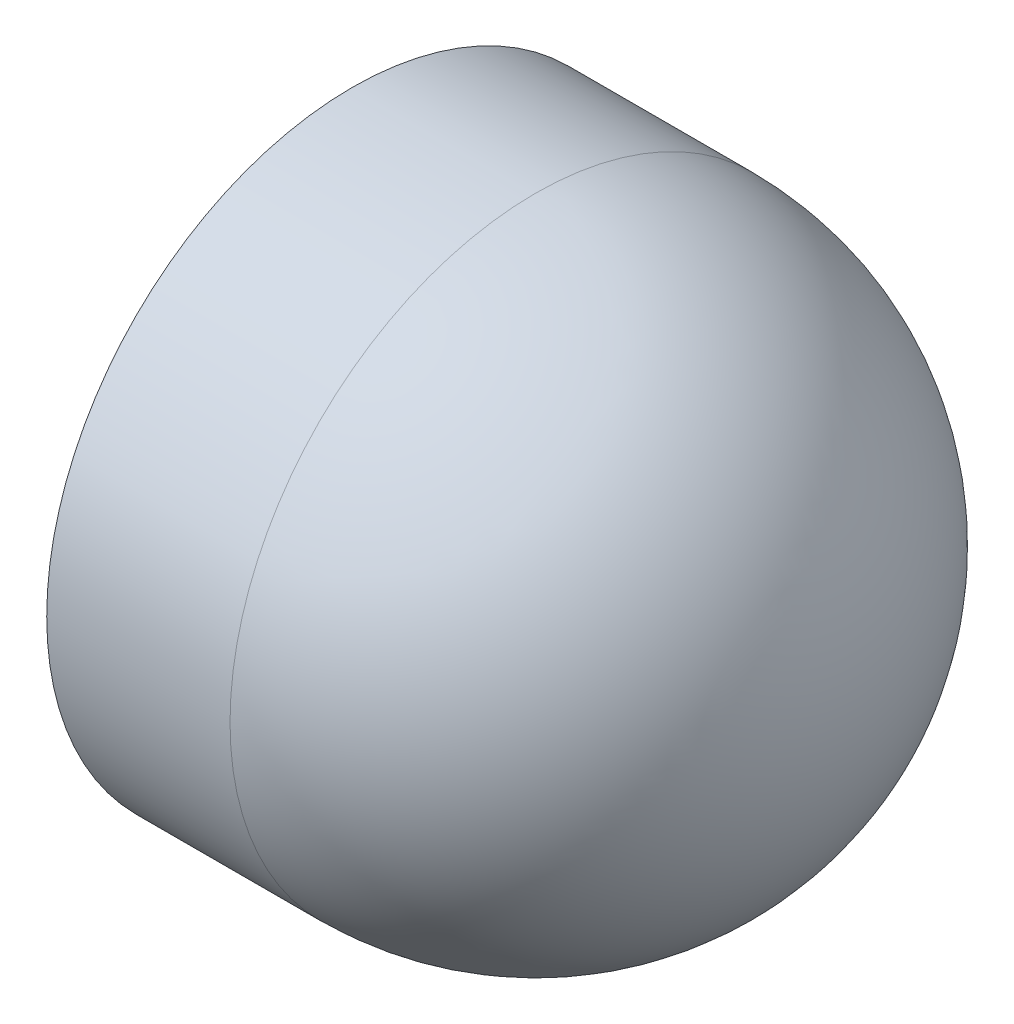
ISO-10303-21;
HEADER;
FILE_DESCRIPTION(('STEP AP214'),'2;1');
FILE_NAME('part.step','',(''),(''),'','','');
FILE_SCHEMA(('AUTOMOTIVE_DESIGN { 1 0 10303 214 1 1 1 1 }'));
ENDSEC;
DATA;
#1=APPLICATION_CONTEXT('core data for automotive mechanical design processes');
#2=APPLICATION_PROTOCOL_DEFINITION('international standard','automotive_design',2000,#1);
#3=PRODUCT_CONTEXT('',#1,'mechanical');
#4=PRODUCT('Part','Part','',(#3));
#5=PRODUCT_RELATED_PRODUCT_CATEGORY('part','',(#4));
#6=PRODUCT_DEFINITION_FORMATION('','',#4);
#7=PRODUCT_DEFINITION_CONTEXT('part definition',#1,'design');
#8=PRODUCT_DEFINITION('design','',#6,#7);
#9=PRODUCT_DEFINITION_SHAPE('','',#8);
#10=(LENGTH_UNIT() NAMED_UNIT(*) SI_UNIT(.MILLI.,.METRE.));
#11=(NAMED_UNIT(*) PLANE_ANGLE_UNIT() SI_UNIT($,.RADIAN.));
#12=(NAMED_UNIT(*) SI_UNIT($,.STERADIAN.) SOLID_ANGLE_UNIT());
#13=UNCERTAINTY_MEASURE_WITH_UNIT(LENGTH_MEASURE(1.E-05),#10,'distance_accuracy_value','');
#14=(GEOMETRIC_REPRESENTATION_CONTEXT(3) GLOBAL_UNCERTAINTY_ASSIGNED_CONTEXT((#13)) GLOBAL_UNIT_ASSIGNED_CONTEXT((#10,
#11,#12)) REPRESENTATION_CONTEXT('',''));
#15=CARTESIAN_POINT('',(0.,0.,0.));
#16=DIRECTION('',(0.,0.,1.));
#17=DIRECTION('',(1.,0.,0.));
#18=AXIS2_PLACEMENT_3D('',#15,#16,#17);
#19=CARTESIAN_POINT('',(0.,0.,0.));
#20=DIRECTION('',(-1.,0.,0.));
#21=DIRECTION('',(0.,0.,1.));
#22=AXIS2_PLACEMENT_3D('',#19,#20,#21);
#23=PLANE('',#22);
#24=CARTESIAN_POINT('',(0.,-2.74999999999999,-4.76313972081442));
#25=DIRECTION('',(-1.,0.,0.));
#26=DIRECTION('',(0.,0.,1.));
#27=AXIS2_PLACEMENT_3D('',#24,#25,#26);
#28=CIRCLE('',#27,1.127);
#29=CARTESIAN_POINT('',(0.,-2.74999999999999,-3.63613972081442));
#30=VERTEX_POINT('',#29);
#31=EDGE_CURVE('E175',#30,#30,#28,.T.);
#32=ORIENTED_EDGE('',*,*,#31,.F.);
#33=EDGE_LOOP('',(#32));
#34=FACE_BOUND('',#33,.T.);
#35=CARTESIAN_POINT('',(0.,5.5,0.));
#36=DIRECTION('',(-1.,0.,0.));
#37=DIRECTION('',(0.,0.,1.));
#38=AXIS2_PLACEMENT_3D('',#35,#36,#37);
#39=CIRCLE('',#38,1.127);
#40=CARTESIAN_POINT('',(0.,5.5,1.127));
#41=VERTEX_POINT('',#40);
#42=EDGE_CURVE('E179',#41,#41,#39,.T.);
#43=ORIENTED_EDGE('',*,*,#42,.F.);
#44=EDGE_LOOP('',(#43));
#45=FACE_BOUND('',#44,.T.);
#46=CARTESIAN_POINT('',(0.,-2.74999999999999,4.76313972081442));
#47=DIRECTION('',(-1.,0.,0.));
#48=DIRECTION('',(0.,0.,1.));
#49=AXIS2_PLACEMENT_3D('',#46,#47,#48);
#50=CIRCLE('',#49,1.127);
#51=CARTESIAN_POINT('',(0.,-2.74999999999999,5.89013972081442));
#52=VERTEX_POINT('',#51);
#53=EDGE_CURVE('E183',#52,#52,#50,.T.);
#54=ORIENTED_EDGE('',*,*,#53,.F.);
#55=EDGE_LOOP('',(#54));
#56=FACE_BOUND('',#55,.T.);
#57=DIRECTION('',(0.,0.866025403784438,-0.5));
#58=VECTOR('',#57,1.);
#59=CARTESIAN_POINT('',(0.,0.,4.1014963123231));
#60=LINE('',#59,#58);
#61=CARTESIAN_POINT('',(0.,0.,4.1014963123231));
#62=VERTEX_POINT('',#61);
#63=CARTESIAN_POINT('',(0.,3.552,2.05074815616155));
#64=VERTEX_POINT('',#63);
#65=EDGE_CURVE('E57',#62,#64,#60,.T.);
#66=ORIENTED_EDGE('',*,*,#65,.F.);
#67=DIRECTION('',(0.,0.866025403784439,0.5));
#68=VECTOR('',#67,1.);
#69=CARTESIAN_POINT('',(0.,-3.552,2.05074815616155));
#70=LINE('',#69,#68);
#71=CARTESIAN_POINT('',(0.,-3.552,2.05074815616155));
#72=VERTEX_POINT('',#71);
#73=EDGE_CURVE('E141',#72,#62,#70,.T.);
#74=ORIENTED_EDGE('',*,*,#73,.F.);
#75=DIRECTION('',(0.,0.,1.));
#76=VECTOR('',#75,1.);
#77=CARTESIAN_POINT('',(0.,-3.552,-2.05074815616155));
#78=LINE('',#77,#76);
#79=CARTESIAN_POINT('',(0.,-3.552,-2.05074815616155));
#80=VERTEX_POINT('',#79);
#81=EDGE_CURVE('E139',#80,#72,#78,.T.);
#82=ORIENTED_EDGE('',*,*,#81,.F.);
#83=DIRECTION('',(0.,-0.866025403784439,0.5));
#84=VECTOR('',#83,1.);
#85=CARTESIAN_POINT('',(0.,0.,-4.1014963123231));
#86=LINE('',#85,#84);
#87=CARTESIAN_POINT('',(0.,0.,-4.1014963123231));
#88=VERTEX_POINT('',#87);
#89=EDGE_CURVE('E105',#88,#80,#86,.T.);
#90=ORIENTED_EDGE('',*,*,#89,.F.);
#91=DIRECTION('',(0.,-0.866025403784439,-0.5));
#92=VECTOR('',#91,1.);
#93=CARTESIAN_POINT('',(0.,3.552,-2.05074815616155));
#94=LINE('',#93,#92);
#95=CARTESIAN_POINT('',(0.,3.552,-2.05074815616155));
#96=VERTEX_POINT('',#95);
#97=EDGE_CURVE('E135',#96,#88,#94,.T.);
#98=ORIENTED_EDGE('',*,*,#97,.F.);
#99=DIRECTION('',(0.,0.,-1.));
#100=VECTOR('',#99,1.);
#101=CARTESIAN_POINT('',(0.,3.552,2.05074815616155));
#102=LINE('',#101,#100);
#103=EDGE_CURVE('E131',#64,#96,#102,.T.);
#104=ORIENTED_EDGE('',*,*,#103,.F.);
#105=EDGE_LOOP('',(#66,#74,#82,#90,#98,#104));
#106=FACE_BOUND('',#105,.T.);
#107=CARTESIAN_POINT('',(0.,0.,0.));
#108=DIRECTION('',(-1.,0.,0.));
#109=DIRECTION('',(0.,0.,1.));
#110=AXIS2_PLACEMENT_3D('',#107,#108,#109);
#111=CIRCLE('',#110,7.5);
#112=CARTESIAN_POINT('',(0.,0.,7.5));
#113=VERTEX_POINT('',#112);
#114=EDGE_CURVE('E11',#113,#113,#111,.T.);
#115=ORIENTED_EDGE('',*,*,#114,.T.);
#116=EDGE_LOOP('',(#115));
#117=FACE_BOUND('',#116,.T.);
#118=ADVANCED_FACE('F43',(#34,#45,#56,#106,#117),#23,.T.);
#119=CARTESIAN_POINT('',(0.,0.,0.));
#120=DIRECTION('',(-1.,0.,0.));
#121=DIRECTION('',(0.,0.,1.));
#122=AXIS2_PLACEMENT_3D('',#119,#120,#121);
#123=CYLINDRICAL_SURFACE('',#122,7.5);
#124=CARTESIAN_POINT('',(4.5,0.,0.));
#125=DIRECTION('',(-1.,0.,0.));
#126=DIRECTION('',(0.,0.,1.));
#127=AXIS2_PLACEMENT_3D('',#124,#125,#126);
#128=CIRCLE('',#127,7.5);
#129=CARTESIAN_POINT('',(4.5,0.,7.5));
#130=VERTEX_POINT('',#129);
#131=EDGE_CURVE('E50',#130,#130,#128,.T.);
#132=ORIENTED_EDGE('',*,*,#131,.T.);
#133=EDGE_LOOP('',(#132));
#134=FACE_BOUND('',#133,.T.);
#135=ORIENTED_EDGE('',*,*,#114,.F.);
#136=EDGE_LOOP('',(#135));
#137=FACE_BOUND('',#136,.T.);
#138=ADVANCED_FACE('F152',(#134,#137),#123,.T.);
#139=CARTESIAN_POINT('',(4.5,0.,0.));
#140=DIRECTION('',(-1.,0.,0.));
#141=DIRECTION('',(0.,-1.,0.));
#142=AXIS2_PLACEMENT_3D('',#139,#140,#141);
#143=SPHERICAL_SURFACE('',#142,7.5);
#144=ORIENTED_EDGE('',*,*,#131,.F.);
#145=EDGE_LOOP('',(#144));
#146=FACE_BOUND('',#145,.T.);
#147=ADVANCED_FACE('F155',(#146),#143,.T.);
#148=CARTESIAN_POINT('',(2.75,0.,4.1014963123231));
#149=DIRECTION('',(0.,0.5,0.866025403784438));
#150=DIRECTION('',(0.,-0.866025403784438,0.5));
#151=AXIS2_PLACEMENT_3D('',#148,#149,#150);
#152=PLANE('',#151);
#153=ORIENTED_EDGE('',*,*,#65,.T.);
#154=DIRECTION('',(-1.,0.,0.));
#155=VECTOR('',#154,1.);
#156=CARTESIAN_POINT('',(2.75,3.552,2.05074815616155));
#157=LINE('',#156,#155);
#158=CARTESIAN_POINT('',(2.75,3.552,2.05074815616155));
#159=VERTEX_POINT('',#158);
#160=EDGE_CURVE('E87',#159,#64,#157,.T.);
#161=ORIENTED_EDGE('',*,*,#160,.F.);
#162=DIRECTION('',(0.,0.866025403784438,-0.5));
#163=VECTOR('',#162,1.);
#164=CARTESIAN_POINT('',(2.75,0.,4.1014963123231));
#165=LINE('',#164,#163);
#166=CARTESIAN_POINT('',(2.75,0.,4.1014963123231));
#167=VERTEX_POINT('',#166);
#168=EDGE_CURVE('E143',#167,#159,#165,.T.);
#169=ORIENTED_EDGE('',*,*,#168,.F.);
#170=DIRECTION('',(-1.,0.,0.));
#171=VECTOR('',#170,1.);
#172=CARTESIAN_POINT('',(2.75,0.,4.1014963123231));
#173=LINE('',#172,#171);
#174=EDGE_CURVE('E65',#167,#62,#173,.T.);
#175=ORIENTED_EDGE('',*,*,#174,.T.);
#176=EDGE_LOOP('',(#153,#161,#169,#175));
#177=FACE_BOUND('',#176,.T.);
#178=ADVANCED_FACE('F157',(#177),#152,.F.);
#179=CARTESIAN_POINT('',(2.75,-3.552,2.05074815616155));
#180=DIRECTION('',(0.,-0.5,0.866025403784439));
#181=DIRECTION('',(0.,-0.866025403784439,-0.5));
#182=AXIS2_PLACEMENT_3D('',#179,#180,#181);
#183=PLANE('',#182);
#184=ORIENTED_EDGE('',*,*,#73,.T.);
#185=ORIENTED_EDGE('',*,*,#174,.F.);
#186=DIRECTION('',(0.,0.866025403784439,0.5));
#187=VECTOR('',#186,1.);
#188=CARTESIAN_POINT('',(2.75,-3.552,2.05074815616155));
#189=LINE('',#188,#187);
#190=CARTESIAN_POINT('',(2.75,-3.552,2.05074815616155));
#191=VERTEX_POINT('',#190);
#192=EDGE_CURVE('E117',#191,#167,#189,.T.);
#193=ORIENTED_EDGE('',*,*,#192,.F.);
#194=DIRECTION('',(-1.,0.,0.));
#195=VECTOR('',#194,1.);
#196=CARTESIAN_POINT('',(2.75,-3.552,2.05074815616155));
#197=LINE('',#196,#195);
#198=EDGE_CURVE('E109',#191,#72,#197,.T.);
#199=ORIENTED_EDGE('',*,*,#198,.T.);
#200=EDGE_LOOP('',(#184,#185,#193,#199));
#201=FACE_BOUND('',#200,.T.);
#202=ADVANCED_FACE('F163',(#201),#183,.F.);
#203=CARTESIAN_POINT('',(2.75,-3.552,-2.05074815616155));
#204=DIRECTION('',(0.,-1.,0.));
#205=DIRECTION('',(0.,0.,-1.));
#206=AXIS2_PLACEMENT_3D('',#203,#204,#205);
#207=PLANE('',#206);
#208=ORIENTED_EDGE('',*,*,#81,.T.);
#209=ORIENTED_EDGE('',*,*,#198,.F.);
#210=DIRECTION('',(0.,0.,1.));
#211=VECTOR('',#210,1.);
#212=CARTESIAN_POINT('',(2.75,-3.552,-2.05074815616155));
#213=LINE('',#212,#211);
#214=CARTESIAN_POINT('',(2.75,-3.552,-2.05074815616155));
#215=VERTEX_POINT('',#214);
#216=EDGE_CURVE('E113',#215,#191,#213,.T.);
#217=ORIENTED_EDGE('',*,*,#216,.F.);
#218=DIRECTION('',(-1.,0.,0.));
#219=VECTOR('',#218,1.);
#220=CARTESIAN_POINT('',(2.75,-3.552,-2.05074815616155));
#221=LINE('',#220,#219);
#222=EDGE_CURVE('E98',#215,#80,#221,.T.);
#223=ORIENTED_EDGE('',*,*,#222,.T.);
#224=EDGE_LOOP('',(#208,#209,#217,#223));
#225=FACE_BOUND('',#224,.T.);
#226=ADVANCED_FACE('F114',(#225),#207,.F.);
#227=CARTESIAN_POINT('',(2.75,0.,-4.1014963123231));
#228=DIRECTION('',(0.,-0.5,-0.866025403784438));
#229=DIRECTION('',(0.,0.866025403784439,-0.5));
#230=AXIS2_PLACEMENT_3D('',#227,#228,#229);
#231=PLANE('',#230);
#232=ORIENTED_EDGE('',*,*,#89,.T.);
#233=ORIENTED_EDGE('',*,*,#222,.F.);
#234=DIRECTION('',(0.,-0.866025403784439,0.5));
#235=VECTOR('',#234,1.);
#236=CARTESIAN_POINT('',(2.75,0.,-4.1014963123231));
#237=LINE('',#236,#235);
#238=CARTESIAN_POINT('',(2.75,0.,-4.1014963123231));
#239=VERTEX_POINT('',#238);
#240=EDGE_CURVE('E102',#239,#215,#237,.T.);
#241=ORIENTED_EDGE('',*,*,#240,.F.);
#242=DIRECTION('',(-1.,0.,0.));
#243=VECTOR('',#242,1.);
#244=CARTESIAN_POINT('',(2.75,0.,-4.1014963123231));
#245=LINE('',#244,#243);
#246=EDGE_CURVE('E110',#239,#88,#245,.T.);
#247=ORIENTED_EDGE('',*,*,#246,.T.);
#248=EDGE_LOOP('',(#232,#233,#241,#247));
#249=FACE_BOUND('',#248,.T.);
#250=ADVANCED_FACE('F100',(#249),#231,.F.);
#251=CARTESIAN_POINT('',(2.75,3.552,-2.05074815616155));
#252=DIRECTION('',(0.,0.5,-0.866025403784439));
#253=DIRECTION('',(0.,0.866025403784439,0.5));
#254=AXIS2_PLACEMENT_3D('',#251,#252,#253);
#255=PLANE('',#254);
#256=ORIENTED_EDGE('',*,*,#97,.T.);
#257=ORIENTED_EDGE('',*,*,#246,.F.);
#258=DIRECTION('',(0.,-0.866025403784439,-0.5));
#259=VECTOR('',#258,1.);
#260=CARTESIAN_POINT('',(2.75,3.552,-2.05074815616155));
#261=LINE('',#260,#259);
#262=CARTESIAN_POINT('',(2.75,3.552,-2.05074815616155));
#263=VERTEX_POINT('',#262);
#264=EDGE_CURVE('E123',#263,#239,#261,.T.);
#265=ORIENTED_EDGE('',*,*,#264,.F.);
#266=DIRECTION('',(-1.,0.,0.));
#267=VECTOR('',#266,1.);
#268=CARTESIAN_POINT('',(2.75,3.552,-2.05074815616155));
#269=LINE('',#268,#267);
#270=EDGE_CURVE('E147',#263,#96,#269,.T.);
#271=ORIENTED_EDGE('',*,*,#270,.T.);
#272=EDGE_LOOP('',(#256,#257,#265,#271));
#273=FACE_BOUND('',#272,.T.);
#274=ADVANCED_FACE('F238',(#273),#255,.F.);
#275=CARTESIAN_POINT('',(2.75,3.552,2.05074815616155));
#276=DIRECTION('',(0.,1.,0.));
#277=DIRECTION('',(0.,0.,1.));
#278=AXIS2_PLACEMENT_3D('',#275,#276,#277);
#279=PLANE('',#278);
#280=ORIENTED_EDGE('',*,*,#103,.T.);
#281=ORIENTED_EDGE('',*,*,#270,.F.);
#282=DIRECTION('',(0.,0.,-1.));
#283=VECTOR('',#282,1.);
#284=CARTESIAN_POINT('',(2.75,3.552,2.05074815616155));
#285=LINE('',#284,#283);
#286=EDGE_CURVE('E125',#159,#263,#285,.T.);
#287=ORIENTED_EDGE('',*,*,#286,.F.);
#288=ORIENTED_EDGE('',*,*,#160,.T.);
#289=EDGE_LOOP('',(#280,#281,#287,#288));
#290=FACE_BOUND('',#289,.T.);
#291=ADVANCED_FACE('F190',(#290),#279,.F.);
#292=CARTESIAN_POINT('',(2.75,0.,0.));
#293=DIRECTION('',(-1.,0.,0.));
#294=DIRECTION('',(0.,0.,1.));
#295=AXIS2_PLACEMENT_3D('',#292,#293,#294);
#296=PLANE('',#295);
#297=ORIENTED_EDGE('',*,*,#168,.T.);
#298=ORIENTED_EDGE('',*,*,#286,.T.);
#299=ORIENTED_EDGE('',*,*,#264,.T.);
#300=ORIENTED_EDGE('',*,*,#240,.T.);
#301=ORIENTED_EDGE('',*,*,#216,.T.);
#302=ORIENTED_EDGE('',*,*,#192,.T.);
#303=EDGE_LOOP('',(#297,#298,#299,#300,#301,#302));
#304=FACE_BOUND('',#303,.T.);
#305=ADVANCED_FACE('F120',(#304),#296,.T.);
#306=CARTESIAN_POINT('',(2.1,-2.74999999999999,4.76313972081442));
#307=DIRECTION('',(-1.,0.,0.));
#308=DIRECTION('',(0.,0.,1.));
#309=AXIS2_PLACEMENT_3D('',#306,#307,#308);
#310=CYLINDRICAL_SURFACE('',#309,1.127);
#311=CARTESIAN_POINT('',(2.1,-2.74999999999999,4.76313972081442));
#312=DIRECTION('',(-1.,0.,0.));
#313=DIRECTION('',(0.,0.,1.));
#314=AXIS2_PLACEMENT_3D('',#311,#312,#313);
#315=CIRCLE('',#314,1.127);
#316=CARTESIAN_POINT('',(2.1,-2.74999999999999,5.89013972081442));
#317=VERTEX_POINT('',#316);
#318=EDGE_CURVE('E193',#317,#317,#315,.T.);
#319=ORIENTED_EDGE('',*,*,#318,.F.);
#320=EDGE_LOOP('',(#319));
#321=FACE_BOUND('',#320,.T.);
#322=ORIENTED_EDGE('',*,*,#53,.T.);
#323=EDGE_LOOP('',(#322));
#324=FACE_BOUND('',#323,.T.);
#325=ADVANCED_FACE('F225',(#321,#324),#310,.F.);
#326=CARTESIAN_POINT('',(2.1,-2.74999999999999,4.76313972081442));
#327=DIRECTION('',(-1.,0.,0.));
#328=DIRECTION('',(0.,0.,1.));
#329=AXIS2_PLACEMENT_3D('',#326,#327,#328);
#330=PLANE('',#329);
#331=ORIENTED_EDGE('',*,*,#318,.T.);
#332=EDGE_LOOP('',(#331));
#333=FACE_BOUND('',#332,.T.);
#334=ADVANCED_FACE('F222',(#333),#330,.T.);
#335=CARTESIAN_POINT('',(2.1,5.5,0.));
#336=DIRECTION('',(-1.,0.,0.));
#337=DIRECTION('',(0.,0.,1.));
#338=AXIS2_PLACEMENT_3D('',#335,#336,#337);
#339=CYLINDRICAL_SURFACE('',#338,1.127);
#340=CARTESIAN_POINT('',(2.1,5.5,0.));
#341=DIRECTION('',(-1.,0.,0.));
#342=DIRECTION('',(0.,0.,1.));
#343=AXIS2_PLACEMENT_3D('',#340,#341,#342);
#344=CIRCLE('',#343,1.127);
#345=CARTESIAN_POINT('',(2.1,5.5,1.127));
#346=VERTEX_POINT('',#345);
#347=EDGE_CURVE('E197',#346,#346,#344,.T.);
#348=ORIENTED_EDGE('',*,*,#347,.F.);
#349=EDGE_LOOP('',(#348));
#350=FACE_BOUND('',#349,.T.);
#351=ORIENTED_EDGE('',*,*,#42,.T.);
#352=EDGE_LOOP('',(#351));
#353=FACE_BOUND('',#352,.T.);
#354=ADVANCED_FACE('F217',(#350,#353),#339,.F.);
#355=CARTESIAN_POINT('',(2.1,5.5,0.));
#356=DIRECTION('',(-1.,0.,0.));
#357=DIRECTION('',(0.,0.,1.));
#358=AXIS2_PLACEMENT_3D('',#355,#356,#357);
#359=PLANE('',#358);
#360=ORIENTED_EDGE('',*,*,#347,.T.);
#361=EDGE_LOOP('',(#360));
#362=FACE_BOUND('',#361,.T.);
#363=ADVANCED_FACE('F210',(#362),#359,.T.);
#364=CARTESIAN_POINT('',(2.1,-2.74999999999999,-4.76313972081442));
#365=DIRECTION('',(-1.,0.,0.));
#366=DIRECTION('',(0.,0.,1.));
#367=AXIS2_PLACEMENT_3D('',#364,#365,#366);
#368=CYLINDRICAL_SURFACE('',#367,1.127);
#369=CARTESIAN_POINT('',(2.1,-2.74999999999999,-4.76313972081442));
#370=DIRECTION('',(-1.,0.,0.));
#371=DIRECTION('',(0.,0.,1.));
#372=AXIS2_PLACEMENT_3D('',#369,#370,#371);
#373=CIRCLE('',#372,1.127);
#374=CARTESIAN_POINT('',(2.1,-2.74999999999999,-3.63613972081442));
#375=VERTEX_POINT('',#374);
#376=EDGE_CURVE('E132',#375,#375,#373,.T.);
#377=ORIENTED_EDGE('',*,*,#376,.F.);
#378=EDGE_LOOP('',(#377));
#379=FACE_BOUND('',#378,.T.);
#380=ORIENTED_EDGE('',*,*,#31,.T.);
#381=EDGE_LOOP('',(#380));
#382=FACE_BOUND('',#381,.T.);
#383=ADVANCED_FACE('F207',(#379,#382),#368,.F.);
#384=CARTESIAN_POINT('',(2.1,-2.74999999999999,-4.76313972081442));
#385=DIRECTION('',(-1.,0.,0.));
#386=DIRECTION('',(0.,0.,1.));
#387=AXIS2_PLACEMENT_3D('',#384,#385,#386);
#388=PLANE('',#387);
#389=ORIENTED_EDGE('',*,*,#376,.T.);
#390=EDGE_LOOP('',(#389));
#391=FACE_BOUND('',#390,.T.);
#392=ADVANCED_FACE('F205',(#391),#388,.T.);
#393=CLOSED_SHELL('',(#118,#138,#147,#178,#202,#226,#250,#274,#291,#305,#325,#334,#354,#363,
#383,#392));
#394=MANIFOLD_SOLID_BREP('B2',#393);
#395=ADVANCED_BREP_SHAPE_REPRESENTATION('',(#18,#394),#14);
#396=SHAPE_DEFINITION_REPRESENTATION(#9,#395);
ENDSEC;
END-ISO-10303-21;
